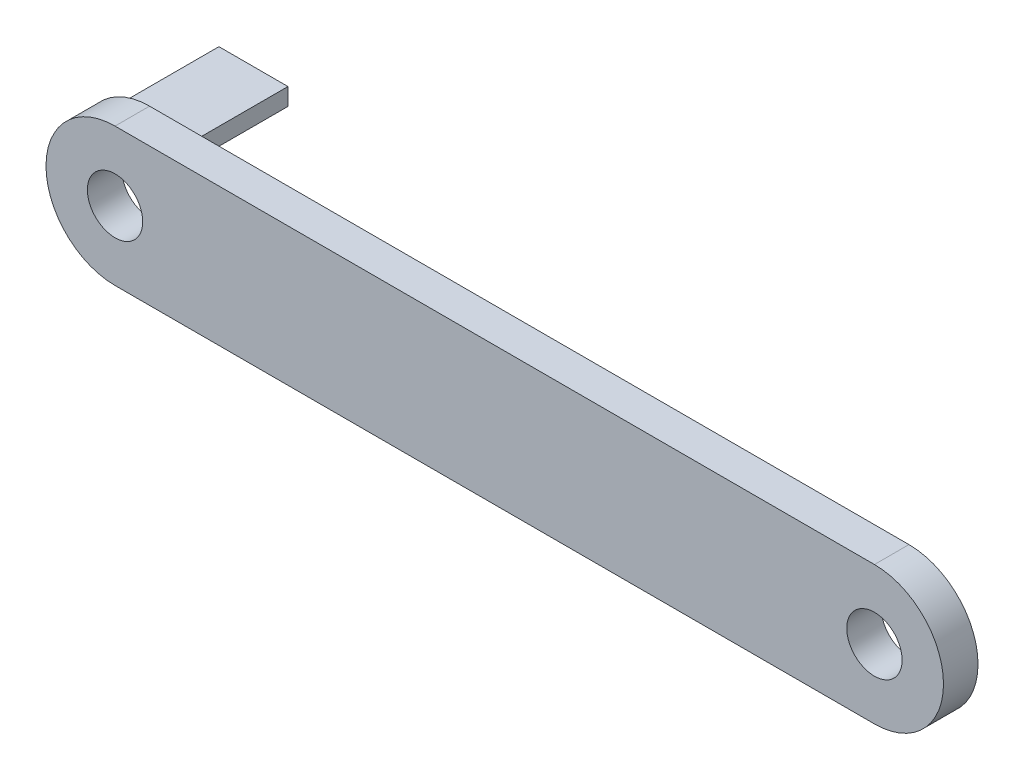
ISO-10303-21;
HEADER;
FILE_DESCRIPTION(('STEP AP214'),'2;1');
FILE_NAME('part.step','',(''),(''),'','','');
FILE_SCHEMA(('AUTOMOTIVE_DESIGN { 1 0 10303 214 1 1 1 1 }'));
ENDSEC;
DATA;
#1=APPLICATION_CONTEXT('core data for automotive mechanical design processes');
#2=APPLICATION_PROTOCOL_DEFINITION('international standard','automotive_design',2000,#1);
#3=PRODUCT_CONTEXT('',#1,'mechanical');
#4=PRODUCT('Part','Part','',(#3));
#5=PRODUCT_RELATED_PRODUCT_CATEGORY('part','',(#4));
#6=PRODUCT_DEFINITION_FORMATION('','',#4);
#7=PRODUCT_DEFINITION_CONTEXT('part definition',#1,'design');
#8=PRODUCT_DEFINITION('design','',#6,#7);
#9=PRODUCT_DEFINITION_SHAPE('','',#8);
#10=(LENGTH_UNIT() NAMED_UNIT(*) SI_UNIT(.MILLI.,.METRE.));
#11=(NAMED_UNIT(*) PLANE_ANGLE_UNIT() SI_UNIT($,.RADIAN.));
#12=(NAMED_UNIT(*) SI_UNIT($,.STERADIAN.) SOLID_ANGLE_UNIT());
#13=UNCERTAINTY_MEASURE_WITH_UNIT(LENGTH_MEASURE(1.E-05),#10,'distance_accuracy_value','');
#14=(GEOMETRIC_REPRESENTATION_CONTEXT(3) GLOBAL_UNCERTAINTY_ASSIGNED_CONTEXT((#13)) GLOBAL_UNIT_ASSIGNED_CONTEXT((#10,
#11,#12)) REPRESENTATION_CONTEXT('',''));
#15=CARTESIAN_POINT('',(0.,0.,0.));
#16=DIRECTION('',(0.,0.,1.));
#17=DIRECTION('',(1.,0.,0.));
#18=AXIS2_PLACEMENT_3D('',#15,#16,#17);
#19=CARTESIAN_POINT('',(0.,0.,5.));
#20=DIRECTION('',(0.,0.,-1.));
#21=DIRECTION('',(-1.,0.,0.));
#22=AXIS2_PLACEMENT_3D('',#19,#20,#21);
#23=CYLINDRICAL_SURFACE('',#22,10.);
#24=CARTESIAN_POINT('',(0.,0.,0.));
#25=DIRECTION('',(0.,0.,1.));
#26=DIRECTION('',(1.,0.,0.));
#27=AXIS2_PLACEMENT_3D('',#24,#25,#26);
#28=CIRCLE('',#27,10.);
#29=CARTESIAN_POINT('',(0.,10.,0.));
#30=VERTEX_POINT('',#29);
#31=CARTESIAN_POINT('',(0.,-10.,0.));
#32=VERTEX_POINT('',#31);
#33=EDGE_CURVE('E162',#30,#32,#28,.T.);
#34=ORIENTED_EDGE('',*,*,#33,.T.);
#35=DIRECTION('',(0.,0.,-1.));
#36=VECTOR('',#35,1.);
#37=CARTESIAN_POINT('',(0.,-10.,5.));
#38=LINE('',#37,#36);
#39=CARTESIAN_POINT('',(0.,-10.,5.));
#40=VERTEX_POINT('',#39);
#41=EDGE_CURVE('E45',#40,#32,#38,.T.);
#42=ORIENTED_EDGE('',*,*,#41,.F.);
#43=CARTESIAN_POINT('',(0.,0.,5.));
#44=DIRECTION('',(0.,0.,1.));
#45=DIRECTION('',(1.,0.,0.));
#46=AXIS2_PLACEMENT_3D('',#43,#44,#45);
#47=CIRCLE('',#46,10.);
#48=CARTESIAN_POINT('',(0.,10.,5.));
#49=VERTEX_POINT('',#48);
#50=EDGE_CURVE('E145',#49,#40,#47,.T.);
#51=ORIENTED_EDGE('',*,*,#50,.F.);
#52=DIRECTION('',(0.,0.,-1.));
#53=VECTOR('',#52,1.);
#54=CARTESIAN_POINT('',(0.,10.,5.));
#55=LINE('',#54,#53);
#56=EDGE_CURVE('E159',#49,#30,#55,.T.);
#57=ORIENTED_EDGE('',*,*,#56,.T.);
#58=EDGE_LOOP('',(#34,#42,#51,#57));
#59=FACE_BOUND('',#58,.T.);
#60=ADVANCED_FACE('F37',(#59),#23,.T.);
#61=CARTESIAN_POINT('',(0.,-10.,5.));
#62=DIRECTION('',(0.,1.,0.));
#63=DIRECTION('',(0.,0.,1.));
#64=AXIS2_PLACEMENT_3D('',#61,#62,#63);
#65=PLANE('',#64);
#66=DIRECTION('',(1.,0.,0.));
#67=VECTOR('',#66,1.);
#68=CARTESIAN_POINT('',(0.,-10.,0.));
#69=LINE('',#68,#67);
#70=CARTESIAN_POINT('',(110.,-10.0000000000639,0.));
#71=VERTEX_POINT('',#70);
#72=EDGE_CURVE('E165',#32,#71,#69,.T.);
#73=ORIENTED_EDGE('',*,*,#72,.T.);
#74=DIRECTION('',(0.,0.,-1.));
#75=VECTOR('',#74,1.);
#76=CARTESIAN_POINT('',(110.,-10.0000000000639,5.));
#77=LINE('',#76,#75);
#78=CARTESIAN_POINT('',(110.,-10.0000000000639,5.));
#79=VERTEX_POINT('',#78);
#80=EDGE_CURVE('E178',#79,#71,#77,.T.);
#81=ORIENTED_EDGE('',*,*,#80,.F.);
#82=DIRECTION('',(1.,0.,0.));
#83=VECTOR('',#82,1.);
#84=CARTESIAN_POINT('',(0.,-10.,5.));
#85=LINE('',#84,#83);
#86=EDGE_CURVE('E149',#40,#79,#85,.T.);
#87=ORIENTED_EDGE('',*,*,#86,.F.);
#88=ORIENTED_EDGE('',*,*,#41,.T.);
#89=EDGE_LOOP('',(#73,#81,#87,#88));
#90=FACE_BOUND('',#89,.T.);
#91=ADVANCED_FACE('F183',(#90),#65,.F.);
#92=CARTESIAN_POINT('',(110.,-6.38881308967498E-11,5.));
#93=DIRECTION('',(0.,0.,-1.));
#94=DIRECTION('',(-1.,0.,0.));
#95=AXIS2_PLACEMENT_3D('',#92,#93,#94);
#96=CYLINDRICAL_SURFACE('',#95,10.0000000000639);
#97=CARTESIAN_POINT('',(110.,-6.38881308967498E-11,0.));
#98=DIRECTION('',(0.,0.,1.));
#99=DIRECTION('',(1.,0.,0.));
#100=AXIS2_PLACEMENT_3D('',#97,#98,#99);
#101=CIRCLE('',#100,10.0000000000639);
#102=CARTESIAN_POINT('',(110.,10.,0.));
#103=VERTEX_POINT('',#102);
#104=EDGE_CURVE('E167',#71,#103,#101,.T.);
#105=ORIENTED_EDGE('',*,*,#104,.T.);
#106=DIRECTION('',(0.,0.,-1.));
#107=VECTOR('',#106,1.);
#108=CARTESIAN_POINT('',(110.,10.,5.));
#109=LINE('',#108,#107);
#110=CARTESIAN_POINT('',(110.,10.,5.));
#111=VERTEX_POINT('',#110);
#112=EDGE_CURVE('E176',#111,#103,#109,.T.);
#113=ORIENTED_EDGE('',*,*,#112,.F.);
#114=CARTESIAN_POINT('',(110.,-6.38881308967498E-11,5.));
#115=DIRECTION('',(0.,0.,1.));
#116=DIRECTION('',(1.,0.,0.));
#117=AXIS2_PLACEMENT_3D('',#114,#115,#116);
#118=CIRCLE('',#117,10.0000000000639);
#119=EDGE_CURVE('E151',#79,#111,#118,.T.);
#120=ORIENTED_EDGE('',*,*,#119,.F.);
#121=ORIENTED_EDGE('',*,*,#80,.T.);
#122=EDGE_LOOP('',(#105,#113,#120,#121));
#123=FACE_BOUND('',#122,.T.);
#124=ADVANCED_FACE('F199',(#123),#96,.T.);
#125=CARTESIAN_POINT('',(0.,10.,5.));
#126=DIRECTION('',(0.,1.,0.));
#127=DIRECTION('',(-1.,0.,0.));
#128=AXIS2_PLACEMENT_3D('',#125,#126,#127);
#129=PLANE('',#128);
#130=DIRECTION('',(1.,0.,0.));
#131=VECTOR('',#130,1.);
#132=CARTESIAN_POINT('',(0.,10.,0.));
#133=LINE('',#132,#131);
#134=EDGE_CURVE('E170',#30,#103,#133,.T.);
#135=ORIENTED_EDGE('',*,*,#134,.F.);
#136=ORIENTED_EDGE('',*,*,#56,.F.);
#137=DIRECTION('',(1.,0.,0.));
#138=VECTOR('',#137,1.);
#139=CARTESIAN_POINT('',(0.,10.,5.));
#140=LINE('',#139,#138);
#141=EDGE_CURVE('E153',#49,#111,#140,.T.);
#142=ORIENTED_EDGE('',*,*,#141,.T.);
#143=ORIENTED_EDGE('',*,*,#112,.T.);
#144=EDGE_LOOP('',(#135,#136,#142,#143));
#145=FACE_BOUND('',#144,.T.);
#146=ADVANCED_FACE('F194',(#145),#129,.T.);
#147=CARTESIAN_POINT('',(0.,0.,5.));
#148=DIRECTION('',(0.,0.,-1.));
#149=DIRECTION('',(-1.,0.,0.));
#150=AXIS2_PLACEMENT_3D('',#147,#148,#149);
#151=CYLINDRICAL_SURFACE('',#150,4.01);
#152=CARTESIAN_POINT('',(0.,0.,5.));
#153=DIRECTION('',(0.,0.,1.));
#154=DIRECTION('',(1.,0.,0.));
#155=AXIS2_PLACEMENT_3D('',#152,#153,#154);
#156=CIRCLE('',#155,4.01);
#157=CARTESIAN_POINT('',(4.01,0.,5.));
#158=VERTEX_POINT('',#157);
#159=EDGE_CURVE('E142',#158,#158,#156,.T.);
#160=ORIENTED_EDGE('',*,*,#159,.T.);
#161=EDGE_LOOP('',(#160));
#162=FACE_BOUND('',#161,.T.);
#163=CARTESIAN_POINT('',(0.,0.,0.));
#164=DIRECTION('',(0.,0.,1.));
#165=DIRECTION('',(1.,0.,0.));
#166=AXIS2_PLACEMENT_3D('',#163,#164,#165);
#167=CIRCLE('',#166,4.01);
#168=CARTESIAN_POINT('',(4.01,0.,0.));
#169=VERTEX_POINT('',#168);
#170=EDGE_CURVE('E141',#169,#169,#167,.T.);
#171=ORIENTED_EDGE('',*,*,#170,.F.);
#172=EDGE_LOOP('',(#171));
#173=FACE_BOUND('',#172,.T.);
#174=ADVANCED_FACE('F39',(#162,#173),#151,.F.);
#175=CARTESIAN_POINT('',(110.,-6.38881308967498E-11,5.));
#176=DIRECTION('',(0.,0.,-1.));
#177=DIRECTION('',(-1.,0.,0.));
#178=AXIS2_PLACEMENT_3D('',#175,#176,#177);
#179=CYLINDRICAL_SURFACE('',#178,4.01);
#180=CARTESIAN_POINT('',(110.,-6.38881308967498E-11,5.));
#181=DIRECTION('',(0.,0.,1.));
#182=DIRECTION('',(1.,0.,0.));
#183=AXIS2_PLACEMENT_3D('',#180,#181,#182);
#184=CIRCLE('',#183,4.01);
#185=CARTESIAN_POINT('',(114.01,-6.38881308967498E-11,5.));
#186=VERTEX_POINT('',#185);
#187=EDGE_CURVE('E156',#186,#186,#184,.T.);
#188=ORIENTED_EDGE('',*,*,#187,.T.);
#189=EDGE_LOOP('',(#188));
#190=FACE_BOUND('',#189,.T.);
#191=CARTESIAN_POINT('',(110.,-6.38881308967498E-11,0.));
#192=DIRECTION('',(0.,0.,1.));
#193=DIRECTION('',(1.,0.,0.));
#194=AXIS2_PLACEMENT_3D('',#191,#192,#193);
#195=CIRCLE('',#194,4.01);
#196=CARTESIAN_POINT('',(114.01,-6.38881308967498E-11,0.));
#197=VERTEX_POINT('',#196);
#198=EDGE_CURVE('E146',#197,#197,#195,.T.);
#199=ORIENTED_EDGE('',*,*,#198,.F.);
#200=EDGE_LOOP('',(#199));
#201=FACE_BOUND('',#200,.T.);
#202=ADVANCED_FACE('F204',(#190,#201),#179,.F.);
#203=CARTESIAN_POINT('',(0.,0.,5.));
#204=DIRECTION('',(0.,0.,1.));
#205=DIRECTION('',(1.,0.,0.));
#206=AXIS2_PLACEMENT_3D('',#203,#204,#205);
#207=PLANE('',#206);
#208=ORIENTED_EDGE('',*,*,#159,.F.);
#209=EDGE_LOOP('',(#208));
#210=FACE_BOUND('',#209,.T.);
#211=ORIENTED_EDGE('',*,*,#50,.T.);
#212=ORIENTED_EDGE('',*,*,#86,.T.);
#213=ORIENTED_EDGE('',*,*,#119,.T.);
#214=ORIENTED_EDGE('',*,*,#141,.F.);
#215=EDGE_LOOP('',(#211,#212,#213,#214));
#216=FACE_BOUND('',#215,.T.);
#217=ORIENTED_EDGE('',*,*,#187,.F.);
#218=EDGE_LOOP('',(#217));
#219=FACE_BOUND('',#218,.T.);
#220=ADVANCED_FACE('F201',(#210,#216,#219),#207,.T.);
#221=CARTESIAN_POINT('',(0.,0.,0.));
#222=DIRECTION('',(0.,0.,1.));
#223=DIRECTION('',(1.,0.,0.));
#224=AXIS2_PLACEMENT_3D('',#221,#222,#223);
#225=PLANE('',#224);
#226=DIRECTION('',(1.,0.,0.));
#227=VECTOR('',#226,1.);
#228=CARTESIAN_POINT('',(0.,4.98516197188792,0.));
#229=LINE('',#228,#227);
#230=CARTESIAN_POINT('',(-4.9531105439371,4.98516197188792,0.));
#231=VERTEX_POINT('',#230);
#232=CARTESIAN_POINT('',(5.0468894560629,4.98516197188792,0.));
#233=VERTEX_POINT('',#232);
#234=EDGE_CURVE('E52',#231,#233,#229,.T.);
#235=ORIENTED_EDGE('',*,*,#234,.T.);
#236=DIRECTION('',(0.,1.,0.));
#237=VECTOR('',#236,1.);
#238=CARTESIAN_POINT('',(5.0468894560629,0.,0.));
#239=LINE('',#238,#237);
#240=CARTESIAN_POINT('',(5.0468894560629,7.48516197188792,0.));
#241=VERTEX_POINT('',#240);
#242=EDGE_CURVE('E106',#233,#241,#239,.T.);
#243=ORIENTED_EDGE('',*,*,#242,.T.);
#244=DIRECTION('',(1.,0.,0.));
#245=VECTOR('',#244,1.);
#246=CARTESIAN_POINT('',(0.,7.48516197188792,0.));
#247=LINE('',#246,#245);
#248=CARTESIAN_POINT('',(-4.9531105439371,7.48516197188792,0.));
#249=VERTEX_POINT('',#248);
#250=EDGE_CURVE('E119',#249,#241,#247,.T.);
#251=ORIENTED_EDGE('',*,*,#250,.F.);
#252=DIRECTION('',(0.,1.,0.));
#253=VECTOR('',#252,1.);
#254=CARTESIAN_POINT('',(-4.9531105439371,0.,0.));
#255=LINE('',#254,#253);
#256=EDGE_CURVE('E57',#231,#249,#255,.T.);
#257=ORIENTED_EDGE('',*,*,#256,.F.);
#258=EDGE_LOOP('',(#235,#243,#251,#257));
#259=FACE_BOUND('',#258,.T.);
#260=CARTESIAN_POINT('',(20.,0.,0.));
#261=DIRECTION('',(0.,0.,1.));
#262=DIRECTION('',(1.,0.,0.));
#263=AXIS2_PLACEMENT_3D('',#260,#261,#262);
#264=CIRCLE('',#263,1.49);
#265=CARTESIAN_POINT('',(21.49,0.,0.));
#266=VERTEX_POINT('',#265);
#267=EDGE_CURVE('E11',#266,#266,#264,.F.);
#268=ORIENTED_EDGE('',*,*,#267,.F.);
#269=EDGE_LOOP('',(#268));
#270=FACE_BOUND('',#269,.T.);
#271=ORIENTED_EDGE('',*,*,#170,.T.);
#272=EDGE_LOOP('',(#271));
#273=FACE_BOUND('',#272,.T.);
#274=ORIENTED_EDGE('',*,*,#33,.F.);
#275=ORIENTED_EDGE('',*,*,#134,.T.);
#276=ORIENTED_EDGE('',*,*,#104,.F.);
#277=ORIENTED_EDGE('',*,*,#72,.F.);
#278=EDGE_LOOP('',(#274,#275,#276,#277));
#279=FACE_BOUND('',#278,.T.);
#280=ORIENTED_EDGE('',*,*,#198,.T.);
#281=EDGE_LOOP('',(#280));
#282=FACE_BOUND('',#281,.T.);
#283=ADVANCED_FACE('F190',(#259,#270,#273,#279,#282),#225,.F.);
#284=CARTESIAN_POINT('',(20.,0.,-4.));
#285=DIRECTION('',(0.,0.,1.));
#286=DIRECTION('',(1.,0.,0.));
#287=AXIS2_PLACEMENT_3D('',#284,#285,#286);
#288=CYLINDRICAL_SURFACE('',#287,1.49);
#289=CARTESIAN_POINT('',(20.,0.,-4.));
#290=DIRECTION('',(0.,0.,-1.));
#291=DIRECTION('',(-1.,0.,0.));
#292=AXIS2_PLACEMENT_3D('',#289,#290,#291);
#293=CIRCLE('',#292,1.49);
#294=CARTESIAN_POINT('',(18.51,0.,-4.));
#295=VERTEX_POINT('',#294);
#296=EDGE_CURVE('E109',#295,#295,#293,.T.);
#297=ORIENTED_EDGE('',*,*,#296,.F.);
#298=EDGE_LOOP('',(#297));
#299=FACE_BOUND('',#298,.T.);
#300=ORIENTED_EDGE('',*,*,#267,.T.);
#301=EDGE_LOOP('',(#300));
#302=FACE_BOUND('',#301,.T.);
#303=ADVANCED_FACE('F214',(#299,#302),#288,.T.);
#304=CARTESIAN_POINT('',(20.,0.,-4.));
#305=DIRECTION('',(0.,0.,-1.));
#306=DIRECTION('',(-1.,0.,0.));
#307=AXIS2_PLACEMENT_3D('',#304,#305,#306);
#308=PLANE('',#307);
#309=ORIENTED_EDGE('',*,*,#296,.T.);
#310=EDGE_LOOP('',(#309));
#311=FACE_BOUND('',#310,.T.);
#312=ADVANCED_FACE('F219',(#311),#308,.T.);
#313=CARTESIAN_POINT('',(5.0468894560629,0.,-15.));
#314=DIRECTION('',(1.,0.,0.));
#315=DIRECTION('',(0.,0.,-1.));
#316=AXIS2_PLACEMENT_3D('',#313,#314,#315);
#317=PLANE('',#316);
#318=ORIENTED_EDGE('',*,*,#242,.F.);
#319=DIRECTION('',(0.,0.,1.));
#320=VECTOR('',#319,1.);
#321=CARTESIAN_POINT('',(5.0468894560629,4.98516197188792,-15.));
#322=LINE('',#321,#320);
#323=CARTESIAN_POINT('',(5.0468894560629,4.98516197188792,-15.));
#324=VERTEX_POINT('',#323);
#325=EDGE_CURVE('E101',#324,#233,#322,.T.);
#326=ORIENTED_EDGE('',*,*,#325,.F.);
#327=DIRECTION('',(0.,1.,0.));
#328=VECTOR('',#327,1.);
#329=CARTESIAN_POINT('',(5.0468894560629,0.,-15.));
#330=LINE('',#329,#328);
#331=CARTESIAN_POINT('',(5.0468894560629,7.48516197188792,-15.));
#332=VERTEX_POINT('',#331);
#333=EDGE_CURVE('E105',#324,#332,#330,.T.);
#334=ORIENTED_EDGE('',*,*,#333,.T.);
#335=DIRECTION('',(0.,0.,1.));
#336=VECTOR('',#335,1.);
#337=CARTESIAN_POINT('',(5.0468894560629,7.48516197188792,-15.));
#338=LINE('',#337,#336);
#339=EDGE_CURVE('E128',#332,#241,#338,.T.);
#340=ORIENTED_EDGE('',*,*,#339,.T.);
#341=EDGE_LOOP('',(#318,#326,#334,#340));
#342=FACE_BOUND('',#341,.T.);
#343=ADVANCED_FACE('F103',(#342),#317,.T.);
#344=CARTESIAN_POINT('',(0.,4.98516197188792,-15.));
#345=DIRECTION('',(0.,-1.,0.));
#346=DIRECTION('',(1.,0.,0.));
#347=AXIS2_PLACEMENT_3D('',#344,#345,#346);
#348=PLANE('',#347);
#349=ORIENTED_EDGE('',*,*,#234,.F.);
#350=DIRECTION('',(0.,0.,1.));
#351=VECTOR('',#350,1.);
#352=CARTESIAN_POINT('',(-4.9531105439371,4.98516197188792,-15.));
#353=LINE('',#352,#351);
#354=CARTESIAN_POINT('',(-4.9531105439371,4.98516197188792,-15.));
#355=VERTEX_POINT('',#354);
#356=EDGE_CURVE('E110',#355,#231,#353,.T.);
#357=ORIENTED_EDGE('',*,*,#356,.F.);
#358=DIRECTION('',(1.,0.,0.));
#359=VECTOR('',#358,1.);
#360=CARTESIAN_POINT('',(0.,4.98516197188792,-15.));
#361=LINE('',#360,#359);
#362=EDGE_CURVE('E115',#355,#324,#361,.T.);
#363=ORIENTED_EDGE('',*,*,#362,.T.);
#364=ORIENTED_EDGE('',*,*,#325,.T.);
#365=EDGE_LOOP('',(#349,#357,#363,#364));
#366=FACE_BOUND('',#365,.T.);
#367=ADVANCED_FACE('F121',(#366),#348,.T.);
#368=CARTESIAN_POINT('',(-4.9531105439371,0.,-15.));
#369=DIRECTION('',(1.,0.,0.));
#370=DIRECTION('',(0.,0.,-1.));
#371=AXIS2_PLACEMENT_3D('',#368,#369,#370);
#372=PLANE('',#371);
#373=ORIENTED_EDGE('',*,*,#256,.T.);
#374=DIRECTION('',(0.,0.,1.));
#375=VECTOR('',#374,1.);
#376=CARTESIAN_POINT('',(-4.9531105439371,7.48516197188792,-15.));
#377=LINE('',#376,#375);
#378=CARTESIAN_POINT('',(-4.9531105439371,7.48516197188792,-15.));
#379=VERTEX_POINT('',#378);
#380=EDGE_CURVE('E135',#379,#249,#377,.T.);
#381=ORIENTED_EDGE('',*,*,#380,.F.);
#382=DIRECTION('',(0.,1.,0.));
#383=VECTOR('',#382,1.);
#384=CARTESIAN_POINT('',(-4.9531105439371,0.,-15.));
#385=LINE('',#384,#383);
#386=EDGE_CURVE('E123',#355,#379,#385,.T.);
#387=ORIENTED_EDGE('',*,*,#386,.F.);
#388=ORIENTED_EDGE('',*,*,#356,.T.);
#389=EDGE_LOOP('',(#373,#381,#387,#388));
#390=FACE_BOUND('',#389,.T.);
#391=ADVANCED_FACE('F290',(#390),#372,.F.);
#392=CARTESIAN_POINT('',(0.,7.48516197188792,-15.));
#393=DIRECTION('',(0.,-1.,0.));
#394=DIRECTION('',(1.,0.,0.));
#395=AXIS2_PLACEMENT_3D('',#392,#393,#394);
#396=PLANE('',#395);
#397=ORIENTED_EDGE('',*,*,#250,.T.);
#398=ORIENTED_EDGE('',*,*,#339,.F.);
#399=DIRECTION('',(1.,0.,0.));
#400=VECTOR('',#399,1.);
#401=CARTESIAN_POINT('',(0.,7.48516197188792,-15.));
#402=LINE('',#401,#400);
#403=EDGE_CURVE('E117',#379,#332,#402,.T.);
#404=ORIENTED_EDGE('',*,*,#403,.F.);
#405=ORIENTED_EDGE('',*,*,#380,.T.);
#406=EDGE_LOOP('',(#397,#398,#404,#405));
#407=FACE_BOUND('',#406,.T.);
#408=ADVANCED_FACE('F299',(#407),#396,.F.);
#409=CARTESIAN_POINT('',(0.,0.,-15.));
#410=DIRECTION('',(0.,0.,-1.));
#411=DIRECTION('',(-1.,0.,0.));
#412=AXIS2_PLACEMENT_3D('',#409,#410,#411);
#413=PLANE('',#412);
#414=ORIENTED_EDGE('',*,*,#333,.F.);
#415=ORIENTED_EDGE('',*,*,#362,.F.);
#416=ORIENTED_EDGE('',*,*,#386,.T.);
#417=ORIENTED_EDGE('',*,*,#403,.T.);
#418=EDGE_LOOP('',(#414,#415,#416,#417));
#419=FACE_BOUND('',#418,.T.);
#420=ADVANCED_FACE('F114',(#419),#413,.T.);
#421=CLOSED_SHELL('',(#60,#91,#124,#146,#174,#202,#220,#283,#303,#312,#343,#367,#391,#408,#420));
#422=MANIFOLD_SOLID_BREP('B2',#421);
#423=ADVANCED_BREP_SHAPE_REPRESENTATION('',(#18,#422),#14);
#424=SHAPE_DEFINITION_REPRESENTATION(#9,#423);
ENDSEC;
END-ISO-10303-21;
